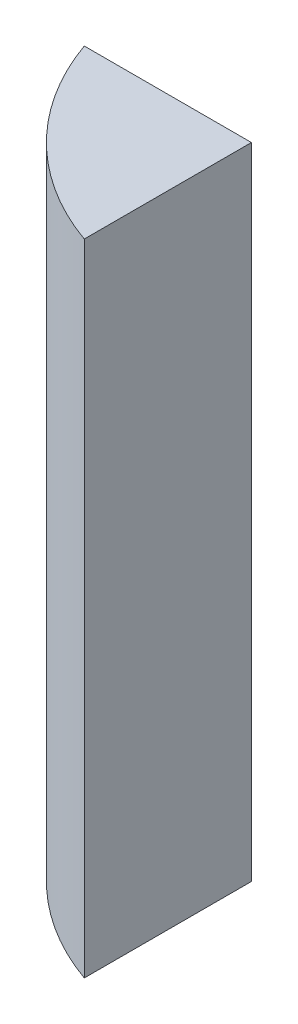
ISO-10303-21;
HEADER;
FILE_DESCRIPTION(('STEP AP214'),'2;1');
FILE_NAME('part.step','',(''),(''),'','','');
FILE_SCHEMA(('AUTOMOTIVE_DESIGN { 1 0 10303 214 1 1 1 1 }'));
ENDSEC;
DATA;
#1=APPLICATION_CONTEXT('core data for automotive mechanical design processes');
#2=APPLICATION_PROTOCOL_DEFINITION('international standard','automotive_design',2000,#1);
#3=PRODUCT_CONTEXT('',#1,'mechanical');
#4=PRODUCT('Part','Part','',(#3));
#5=PRODUCT_RELATED_PRODUCT_CATEGORY('part','',(#4));
#6=PRODUCT_DEFINITION_FORMATION('','',#4);
#7=PRODUCT_DEFINITION_CONTEXT('part definition',#1,'design');
#8=PRODUCT_DEFINITION('design','',#6,#7);
#9=PRODUCT_DEFINITION_SHAPE('','',#8);
#10=(LENGTH_UNIT() NAMED_UNIT(*) SI_UNIT(.MILLI.,.METRE.));
#11=(NAMED_UNIT(*) PLANE_ANGLE_UNIT() SI_UNIT($,.RADIAN.));
#12=(NAMED_UNIT(*) SI_UNIT($,.STERADIAN.) SOLID_ANGLE_UNIT());
#13=UNCERTAINTY_MEASURE_WITH_UNIT(LENGTH_MEASURE(1.E-05),#10,'distance_accuracy_value','');
#14=(GEOMETRIC_REPRESENTATION_CONTEXT(3) GLOBAL_UNCERTAINTY_ASSIGNED_CONTEXT((#13)) GLOBAL_UNIT_ASSIGNED_CONTEXT((#10,
#11,#12)) REPRESENTATION_CONTEXT('',''));
#15=CARTESIAN_POINT('',(0.,0.,0.));
#16=DIRECTION('',(0.,0.,1.));
#17=DIRECTION('',(1.,0.,0.));
#18=AXIS2_PLACEMENT_3D('',#15,#16,#17);
#19=CARTESIAN_POINT('',(0.,140.,20.));
#20=DIRECTION('',(0.,0.,-1.));
#21=DIRECTION('',(-1.,0.,0.));
#22=AXIS2_PLACEMENT_3D('',#19,#20,#21);
#23=PLANE('',#22);
#24=DIRECTION('',(1.,0.,0.));
#25=VECTOR('',#24,1.);
#26=CARTESIAN_POINT('',(0.,0.,20.));
#27=LINE('',#26,#25);
#28=CARTESIAN_POINT('',(-56.5685424949238,0.,20.));
#29=VERTEX_POINT('',#28);
#30=CARTESIAN_POINT('',(-20.,0.,20.));
#31=VERTEX_POINT('',#30);
#32=EDGE_CURVE('E71',#29,#31,#27,.T.);
#33=ORIENTED_EDGE('',*,*,#32,.F.);
#34=DIRECTION('',(0.,-1.,0.));
#35=VECTOR('',#34,1.);
#36=CARTESIAN_POINT('',(-56.5685424949238,140.,20.));
#37=LINE('',#36,#35);
#38=CARTESIAN_POINT('',(-56.5685424949238,140.,20.));
#39=VERTEX_POINT('',#38);
#40=EDGE_CURVE('E11',#39,#29,#37,.T.);
#41=ORIENTED_EDGE('',*,*,#40,.F.);
#42=DIRECTION('',(1.,0.,0.));
#43=VECTOR('',#42,1.);
#44=CARTESIAN_POINT('',(0.,140.,20.));
#45=LINE('',#44,#43);
#46=CARTESIAN_POINT('',(-20.,140.,20.));
#47=VERTEX_POINT('',#46);
#48=EDGE_CURVE('E69',#39,#47,#45,.T.);
#49=ORIENTED_EDGE('',*,*,#48,.T.);
#50=DIRECTION('',(0.,-1.,0.));
#51=VECTOR('',#50,1.);
#52=CARTESIAN_POINT('',(-20.,140.,20.));
#53=LINE('',#52,#51);
#54=EDGE_CURVE('E51',#47,#31,#53,.T.);
#55=ORIENTED_EDGE('',*,*,#54,.T.);
#56=EDGE_LOOP('',(#33,#41,#49,#55));
#57=FACE_BOUND('',#56,.T.);
#58=ADVANCED_FACE('F35',(#57),#23,.T.);
#59=CARTESIAN_POINT('',(0.,140.,0.));
#60=DIRECTION('',(0.,-1.,0.));
#61=DIRECTION('',(0.,0.,-1.));
#62=AXIS2_PLACEMENT_3D('',#59,#60,#61);
#63=CYLINDRICAL_SURFACE('',#62,60.);
#64=CARTESIAN_POINT('',(0.,0.,0.));
#65=DIRECTION('',(0.,1.,0.));
#66=DIRECTION('',(0.,0.,1.));
#67=AXIS2_PLACEMENT_3D('',#64,#65,#66);
#68=CIRCLE('',#67,60.);
#69=CARTESIAN_POINT('',(-20.,0.,56.5685424949238));
#70=VERTEX_POINT('',#69);
#71=EDGE_CURVE('E83',#29,#70,#68,.T.);
#72=ORIENTED_EDGE('',*,*,#71,.T.);
#73=DIRECTION('',(0.,-1.,0.));
#74=VECTOR('',#73,1.);
#75=CARTESIAN_POINT('',(-20.,140.,56.5685424949238));
#76=LINE('',#75,#74);
#77=CARTESIAN_POINT('',(-20.,140.,56.5685424949238));
#78=VERTEX_POINT('',#77);
#79=EDGE_CURVE('E43',#78,#70,#76,.T.);
#80=ORIENTED_EDGE('',*,*,#79,.F.);
#81=CARTESIAN_POINT('',(0.,140.,0.));
#82=DIRECTION('',(0.,1.,0.));
#83=DIRECTION('',(0.,0.,1.));
#84=AXIS2_PLACEMENT_3D('',#81,#82,#83);
#85=CIRCLE('',#84,60.);
#86=EDGE_CURVE('E74',#39,#78,#85,.T.);
#87=ORIENTED_EDGE('',*,*,#86,.F.);
#88=ORIENTED_EDGE('',*,*,#40,.T.);
#89=EDGE_LOOP('',(#72,#80,#87,#88));
#90=FACE_BOUND('',#89,.T.);
#91=ADVANCED_FACE('F75',(#90),#63,.T.);
#92=CARTESIAN_POINT('',(-20.,140.,0.));
#93=DIRECTION('',(1.,0.,0.));
#94=DIRECTION('',(0.,0.,-1.));
#95=AXIS2_PLACEMENT_3D('',#92,#93,#94);
#96=PLANE('',#95);
#97=DIRECTION('',(0.,0.,1.));
#98=VECTOR('',#97,1.);
#99=CARTESIAN_POINT('',(-20.,0.,0.));
#100=LINE('',#99,#98);
#101=EDGE_CURVE('E80',#31,#70,#100,.T.);
#102=ORIENTED_EDGE('',*,*,#101,.F.);
#103=ORIENTED_EDGE('',*,*,#54,.F.);
#104=DIRECTION('',(0.,0.,1.));
#105=VECTOR('',#104,1.);
#106=CARTESIAN_POINT('',(-20.,140.,0.));
#107=LINE('',#106,#105);
#108=EDGE_CURVE('E77',#47,#78,#107,.T.);
#109=ORIENTED_EDGE('',*,*,#108,.T.);
#110=ORIENTED_EDGE('',*,*,#79,.T.);
#111=EDGE_LOOP('',(#102,#103,#109,#110));
#112=FACE_BOUND('',#111,.T.);
#113=ADVANCED_FACE('F91',(#112),#96,.T.);
#114=CARTESIAN_POINT('',(0.,140.,0.));
#115=DIRECTION('',(0.,1.,0.));
#116=DIRECTION('',(0.,0.,1.));
#117=AXIS2_PLACEMENT_3D('',#114,#115,#116);
#118=PLANE('',#117);
#119=ORIENTED_EDGE('',*,*,#48,.F.);
#120=ORIENTED_EDGE('',*,*,#86,.T.);
#121=ORIENTED_EDGE('',*,*,#108,.F.);
#122=EDGE_LOOP('',(#119,#120,#121));
#123=FACE_BOUND('',#122,.T.);
#124=ADVANCED_FACE('F79',(#123),#118,.T.);
#125=CARTESIAN_POINT('',(0.,0.,0.));
#126=DIRECTION('',(0.,1.,0.));
#127=DIRECTION('',(0.,0.,1.));
#128=AXIS2_PLACEMENT_3D('',#125,#126,#127);
#129=PLANE('',#128);
#130=ORIENTED_EDGE('',*,*,#32,.T.);
#131=ORIENTED_EDGE('',*,*,#101,.T.);
#132=ORIENTED_EDGE('',*,*,#71,.F.);
#133=EDGE_LOOP('',(#130,#131,#132));
#134=FACE_BOUND('',#133,.T.);
#135=ADVANCED_FACE('F90',(#134),#129,.F.);
#136=CLOSED_SHELL('',(#58,#91,#113,#124,#135));
#137=MANIFOLD_SOLID_BREP('B2',#136);
#138=ADVANCED_BREP_SHAPE_REPRESENTATION('',(#18,#137),#14);
#139=SHAPE_DEFINITION_REPRESENTATION(#9,#138);
ENDSEC;
END-ISO-10303-21;
